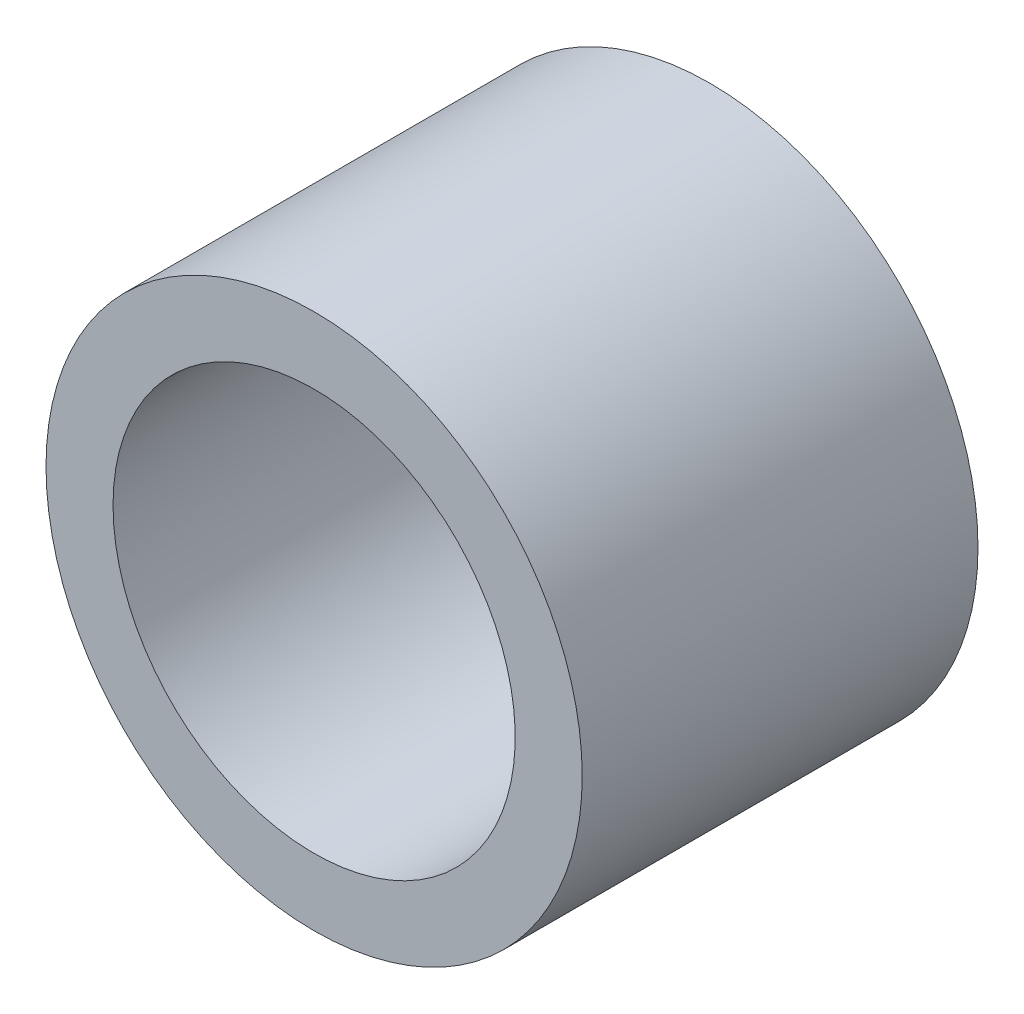
ISO-10303-21;
HEADER;
FILE_DESCRIPTION(('STEP AP214'),'2;1');
FILE_NAME('part.step','',(''),(''),'','','');
FILE_SCHEMA(('AUTOMOTIVE_DESIGN { 1 0 10303 214 1 1 1 1 }'));
ENDSEC;
DATA;
#1=APPLICATION_CONTEXT('core data for automotive mechanical design processes');
#2=APPLICATION_PROTOCOL_DEFINITION('international standard','automotive_design',2000,#1);
#3=PRODUCT_CONTEXT('',#1,'mechanical');
#4=PRODUCT('Part','Part','',(#3));
#5=PRODUCT_RELATED_PRODUCT_CATEGORY('part','',(#4));
#6=PRODUCT_DEFINITION_FORMATION('','',#4);
#7=PRODUCT_DEFINITION_CONTEXT('part definition',#1,'design');
#8=PRODUCT_DEFINITION('design','',#6,#7);
#9=PRODUCT_DEFINITION_SHAPE('','',#8);
#10=(LENGTH_UNIT() NAMED_UNIT(*) SI_UNIT(.MILLI.,.METRE.));
#11=(NAMED_UNIT(*) PLANE_ANGLE_UNIT() SI_UNIT($,.RADIAN.));
#12=(NAMED_UNIT(*) SI_UNIT($,.STERADIAN.) SOLID_ANGLE_UNIT());
#13=UNCERTAINTY_MEASURE_WITH_UNIT(LENGTH_MEASURE(1.E-05),#10,'distance_accuracy_value','');
#14=(GEOMETRIC_REPRESENTATION_CONTEXT(3) GLOBAL_UNCERTAINTY_ASSIGNED_CONTEXT((#13)) GLOBAL_UNIT_ASSIGNED_CONTEXT((#10,
#11,#12)) REPRESENTATION_CONTEXT('',''));
#15=CARTESIAN_POINT('',(0.,0.,0.));
#16=DIRECTION('',(0.,0.,1.));
#17=DIRECTION('',(1.,0.,0.));
#18=AXIS2_PLACEMENT_3D('',#15,#16,#17);
#19=CARTESIAN_POINT('',(0.,0.,6.2));
#20=DIRECTION('',(0.,0.,1.));
#21=DIRECTION('',(1.,0.,0.));
#22=AXIS2_PLACEMENT_3D('',#19,#20,#21);
#23=PLANE('',#22);
#24=CARTESIAN_POINT('',(0.,0.,6.2));
#25=DIRECTION('',(0.,0.,1.));
#26=DIRECTION('',(1.,0.,0.));
#27=AXIS2_PLACEMENT_3D('',#24,#25,#26);
#28=CIRCLE('',#27,4.2);
#29=CARTESIAN_POINT('',(-4.2,0.,6.2));
#30=VERTEX_POINT('',#29);
#31=EDGE_CURVE('E10',#30,#30,#28,.T.);
#32=ORIENTED_EDGE('',*,*,#31,.T.);
#33=EDGE_LOOP('',(#32));
#34=FACE_BOUND('',#33,.T.);
#35=CARTESIAN_POINT('',(0.,0.,6.2));
#36=DIRECTION('',(0.,0.,1.));
#37=DIRECTION('',(1.,0.,0.));
#38=AXIS2_PLACEMENT_3D('',#35,#36,#37);
#39=CIRCLE('',#38,3.15);
#40=CARTESIAN_POINT('',(-3.15,0.,6.2));
#41=VERTEX_POINT('',#40);
#42=EDGE_CURVE('E48',#41,#41,#39,.T.);
#43=ORIENTED_EDGE('',*,*,#42,.F.);
#44=EDGE_LOOP('',(#43));
#45=FACE_BOUND('',#44,.T.);
#46=ADVANCED_FACE('F40',(#34,#45),#23,.T.);
#47=CARTESIAN_POINT('',(0.,0.,0.));
#48=DIRECTION('',(0.,0.,1.));
#49=DIRECTION('',(1.,0.,0.));
#50=AXIS2_PLACEMENT_3D('',#47,#48,#49);
#51=PLANE('',#50);
#52=CARTESIAN_POINT('',(0.,0.,0.));
#53=DIRECTION('',(0.,0.,1.));
#54=DIRECTION('',(1.,0.,0.));
#55=AXIS2_PLACEMENT_3D('',#52,#53,#54);
#56=CIRCLE('',#55,4.2);
#57=CARTESIAN_POINT('',(-4.2,0.,0.));
#58=VERTEX_POINT('',#57);
#59=EDGE_CURVE('E41',#58,#58,#56,.T.);
#60=ORIENTED_EDGE('',*,*,#59,.F.);
#61=EDGE_LOOP('',(#60));
#62=FACE_BOUND('',#61,.T.);
#63=CARTESIAN_POINT('',(0.,0.,0.));
#64=DIRECTION('',(0.,0.,1.));
#65=DIRECTION('',(1.,0.,0.));
#66=AXIS2_PLACEMENT_3D('',#63,#64,#65);
#67=CIRCLE('',#66,3.15);
#68=CARTESIAN_POINT('',(-3.15,0.,0.));
#69=VERTEX_POINT('',#68);
#70=EDGE_CURVE('E49',#69,#69,#67,.T.);
#71=ORIENTED_EDGE('',*,*,#70,.T.);
#72=EDGE_LOOP('',(#71));
#73=FACE_BOUND('',#72,.T.);
#74=ADVANCED_FACE('F58',(#62,#73),#51,.F.);
#75=CARTESIAN_POINT('',(0.,0.,6.2));
#76=DIRECTION('',(0.,0.,-1.));
#77=DIRECTION('',(-1.,0.,0.));
#78=AXIS2_PLACEMENT_3D('',#75,#76,#77);
#79=CYLINDRICAL_SURFACE('',#78,4.2);
#80=CARTESIAN_POINT('',(-4.2,0.,6.2));
#81=CARTESIAN_POINT('',(-4.2,0.,6.13541666666667));
#82=CARTESIAN_POINT('',(-4.2,0.,6.07083333333333));
#83=CARTESIAN_POINT('',(-4.2,0.,5.94166666666667));
#84=CARTESIAN_POINT('',(-4.2,0.,5.87708333333333));
#85=CARTESIAN_POINT('',(-4.2,0.,5.74791666666667));
#86=CARTESIAN_POINT('',(-4.2,0.,5.68333333333333));
#87=CARTESIAN_POINT('',(-4.2,0.,5.55416666666667));
#88=CARTESIAN_POINT('',(-4.2,0.,5.48958333333333));
#89=CARTESIAN_POINT('',(-4.2,0.,5.36041666666667));
#90=CARTESIAN_POINT('',(-4.2,0.,5.29583333333333));
#91=CARTESIAN_POINT('',(-4.2,0.,5.16666666666667));
#92=CARTESIAN_POINT('',(-4.2,0.,5.10208333333333));
#93=CARTESIAN_POINT('',(-4.2,0.,4.97291666666667));
#94=CARTESIAN_POINT('',(-4.2,0.,4.90833333333333));
#95=CARTESIAN_POINT('',(-4.2,0.,4.77916666666667));
#96=CARTESIAN_POINT('',(-4.2,0.,4.71458333333333));
#97=CARTESIAN_POINT('',(-4.2,0.,4.58541666666667));
#98=CARTESIAN_POINT('',(-4.2,0.,4.52083333333333));
#99=CARTESIAN_POINT('',(-4.2,0.,4.39166666666667));
#100=CARTESIAN_POINT('',(-4.2,0.,4.32708333333333));
#101=CARTESIAN_POINT('',(-4.2,0.,4.19791666666667));
#102=CARTESIAN_POINT('',(-4.2,0.,4.13333333333333));
#103=CARTESIAN_POINT('',(-4.2,0.,4.00416666666667));
#104=CARTESIAN_POINT('',(-4.2,0.,3.93958333333333));
#105=CARTESIAN_POINT('',(-4.2,0.,3.81041666666667));
#106=CARTESIAN_POINT('',(-4.2,0.,3.74583333333333));
#107=CARTESIAN_POINT('',(-4.2,0.,3.61666666666667));
#108=CARTESIAN_POINT('',(-4.2,0.,3.55208333333333));
#109=CARTESIAN_POINT('',(-4.2,0.,3.42291666666667));
#110=CARTESIAN_POINT('',(-4.2,0.,3.35833333333333));
#111=CARTESIAN_POINT('',(-4.2,0.,3.22916666666667));
#112=CARTESIAN_POINT('',(-4.2,0.,3.16458333333333));
#113=CARTESIAN_POINT('',(-4.2,0.,3.03541666666667));
#114=CARTESIAN_POINT('',(-4.2,0.,2.97083333333333));
#115=CARTESIAN_POINT('',(-4.2,0.,2.84166666666667));
#116=CARTESIAN_POINT('',(-4.2,0.,2.77708333333333));
#117=CARTESIAN_POINT('',(-4.2,0.,2.64791666666667));
#118=CARTESIAN_POINT('',(-4.2,0.,2.58333333333333));
#119=CARTESIAN_POINT('',(-4.2,0.,2.45416666666667));
#120=CARTESIAN_POINT('',(-4.2,0.,2.38958333333333));
#121=CARTESIAN_POINT('',(-4.2,0.,2.26041666666667));
#122=CARTESIAN_POINT('',(-4.2,0.,2.19583333333333));
#123=CARTESIAN_POINT('',(-4.2,0.,2.06666666666667));
#124=CARTESIAN_POINT('',(-4.2,0.,2.00208333333333));
#125=CARTESIAN_POINT('',(-4.2,0.,1.87291666666667));
#126=CARTESIAN_POINT('',(-4.2,0.,1.80833333333333));
#127=CARTESIAN_POINT('',(-4.2,0.,1.67916666666667));
#128=CARTESIAN_POINT('',(-4.2,0.,1.61458333333333));
#129=CARTESIAN_POINT('',(-4.2,0.,1.48541666666667));
#130=CARTESIAN_POINT('',(-4.2,0.,1.42083333333333));
#131=CARTESIAN_POINT('',(-4.2,0.,1.29166666666667));
#132=CARTESIAN_POINT('',(-4.2,0.,1.22708333333333));
#133=CARTESIAN_POINT('',(-4.2,0.,1.09791666666667));
#134=CARTESIAN_POINT('',(-4.2,0.,1.03333333333333));
#135=CARTESIAN_POINT('',(-4.2,0.,0.904166666666667));
#136=CARTESIAN_POINT('',(-4.2,0.,0.839583333333333));
#137=CARTESIAN_POINT('',(-4.2,0.,0.710416666666666));
#138=CARTESIAN_POINT('',(-4.2,0.,0.645833333333333));
#139=CARTESIAN_POINT('',(-4.2,0.,0.516666666666667));
#140=CARTESIAN_POINT('',(-4.2,0.,0.452083333333333));
#141=CARTESIAN_POINT('',(-4.2,0.,0.322916666666667));
#142=CARTESIAN_POINT('',(-4.2,0.,0.258333333333334));
#143=CARTESIAN_POINT('',(-4.2,0.,0.129166666666667));
#144=CARTESIAN_POINT('',(-4.2,0.,0.0645833333333335));
#145=CARTESIAN_POINT('',(-4.2,0.,0.));
#146=B_SPLINE_CURVE_WITH_KNOTS('',3,(#80,#81,#82,#83,#84,#85,#86,#87,#88,#89,#90,#91,#92,#93,
#94,#95,#96,#97,#98,#99,#100,#101,#102,#103,#104,#105,#106,#107,#108,#109,#110,#111,#112,#113,
#114,#115,#116,#117,#118,#119,#120,#121,#122,#123,#124,#125,#126,#127,#128,#129,#130,#131,#132,
#133,#134,#135,#136,#137,#138,#139,#140,#141,#142,#143,#144,#145),.UNSPECIFIED.,.F.,.F.,(4,2,2,
2,2,2,2,2,2,2,2,2,2,2,2,2,2,2,2,2,2,2,2,2,2,2,2,2,2,2,2,2,4),(0.,0.193749999999999,0.3875,
0.581249999999999,0.775,0.968749999999999,1.1625,1.35625,1.55,1.74375,1.9375,2.13125,2.325,
2.51875,2.7125,2.90625,3.1,3.29375,3.4875,3.68125,3.875,4.06875,4.2625,4.45625,4.65,4.84375,
5.0375,5.23125,5.425,5.61875,5.8125,6.00625,6.2),.UNSPECIFIED.);
#147=EDGE_CURVE('BSEAM39',#30,#58,#146,.T.);
#148=ORIENTED_EDGE('',*,*,#31,.F.);
#149=ORIENTED_EDGE('',*,*,#59,.T.);
#150=ORIENTED_EDGE('',*,*,#147,.T.);
#151=ORIENTED_EDGE('',*,*,#147,.F.);
#152=EDGE_LOOP('',(#148,#150,#149,#151));
#153=FACE_BOUND('',#152,.T.);
#154=ADVANCED_FACE('F39',(#153),#79,.T.);
#155=CARTESIAN_POINT('',(0.,0.,6.2));
#156=DIRECTION('',(0.,0.,-1.));
#157=DIRECTION('',(-1.,0.,0.));
#158=AXIS2_PLACEMENT_3D('',#155,#156,#157);
#159=CYLINDRICAL_SURFACE('',#158,3.15);
#160=CARTESIAN_POINT('',(-3.15,0.,6.2));
#161=CARTESIAN_POINT('',(-3.15,0.,6.13541666666667));
#162=CARTESIAN_POINT('',(-3.15,0.,6.07083333333333));
#163=CARTESIAN_POINT('',(-3.15,0.,5.94166666666667));
#164=CARTESIAN_POINT('',(-3.15,0.,5.87708333333333));
#165=CARTESIAN_POINT('',(-3.15,0.,5.74791666666667));
#166=CARTESIAN_POINT('',(-3.15,0.,5.68333333333333));
#167=CARTESIAN_POINT('',(-3.15,0.,5.55416666666667));
#168=CARTESIAN_POINT('',(-3.15,0.,5.48958333333333));
#169=CARTESIAN_POINT('',(-3.15,0.,5.36041666666667));
#170=CARTESIAN_POINT('',(-3.15,0.,5.29583333333333));
#171=CARTESIAN_POINT('',(-3.15,0.,5.16666666666667));
#172=CARTESIAN_POINT('',(-3.15,0.,5.10208333333333));
#173=CARTESIAN_POINT('',(-3.15,0.,4.97291666666667));
#174=CARTESIAN_POINT('',(-3.15,0.,4.90833333333333));
#175=CARTESIAN_POINT('',(-3.15,0.,4.77916666666667));
#176=CARTESIAN_POINT('',(-3.15,0.,4.71458333333333));
#177=CARTESIAN_POINT('',(-3.15,0.,4.58541666666667));
#178=CARTESIAN_POINT('',(-3.15,0.,4.52083333333333));
#179=CARTESIAN_POINT('',(-3.15,0.,4.39166666666667));
#180=CARTESIAN_POINT('',(-3.15,0.,4.32708333333333));
#181=CARTESIAN_POINT('',(-3.15,0.,4.19791666666667));
#182=CARTESIAN_POINT('',(-3.15,0.,4.13333333333333));
#183=CARTESIAN_POINT('',(-3.15,0.,4.00416666666667));
#184=CARTESIAN_POINT('',(-3.15,0.,3.93958333333333));
#185=CARTESIAN_POINT('',(-3.15,0.,3.81041666666667));
#186=CARTESIAN_POINT('',(-3.15,0.,3.74583333333333));
#187=CARTESIAN_POINT('',(-3.15,0.,3.61666666666667));
#188=CARTESIAN_POINT('',(-3.15,0.,3.55208333333333));
#189=CARTESIAN_POINT('',(-3.15,0.,3.42291666666667));
#190=CARTESIAN_POINT('',(-3.15,0.,3.35833333333333));
#191=CARTESIAN_POINT('',(-3.15,0.,3.22916666666667));
#192=CARTESIAN_POINT('',(-3.15,0.,3.16458333333333));
#193=CARTESIAN_POINT('',(-3.15,0.,3.03541666666667));
#194=CARTESIAN_POINT('',(-3.15,0.,2.97083333333333));
#195=CARTESIAN_POINT('',(-3.15,0.,2.84166666666667));
#196=CARTESIAN_POINT('',(-3.15,0.,2.77708333333333));
#197=CARTESIAN_POINT('',(-3.15,0.,2.64791666666667));
#198=CARTESIAN_POINT('',(-3.15,0.,2.58333333333333));
#199=CARTESIAN_POINT('',(-3.15,0.,2.45416666666667));
#200=CARTESIAN_POINT('',(-3.15,0.,2.38958333333333));
#201=CARTESIAN_POINT('',(-3.15,0.,2.26041666666667));
#202=CARTESIAN_POINT('',(-3.15,0.,2.19583333333333));
#203=CARTESIAN_POINT('',(-3.15,0.,2.06666666666667));
#204=CARTESIAN_POINT('',(-3.15,0.,2.00208333333333));
#205=CARTESIAN_POINT('',(-3.15,0.,1.87291666666667));
#206=CARTESIAN_POINT('',(-3.15,0.,1.80833333333333));
#207=CARTESIAN_POINT('',(-3.15,0.,1.67916666666667));
#208=CARTESIAN_POINT('',(-3.15,0.,1.61458333333333));
#209=CARTESIAN_POINT('',(-3.15,0.,1.48541666666667));
#210=CARTESIAN_POINT('',(-3.15,0.,1.42083333333333));
#211=CARTESIAN_POINT('',(-3.15,0.,1.29166666666667));
#212=CARTESIAN_POINT('',(-3.15,0.,1.22708333333333));
#213=CARTESIAN_POINT('',(-3.15,0.,1.09791666666667));
#214=CARTESIAN_POINT('',(-3.15,0.,1.03333333333333));
#215=CARTESIAN_POINT('',(-3.15,0.,0.904166666666667));
#216=CARTESIAN_POINT('',(-3.15,0.,0.839583333333333));
#217=CARTESIAN_POINT('',(-3.15,0.,0.710416666666666));
#218=CARTESIAN_POINT('',(-3.15,0.,0.645833333333333));
#219=CARTESIAN_POINT('',(-3.15,0.,0.516666666666667));
#220=CARTESIAN_POINT('',(-3.15,0.,0.452083333333333));
#221=CARTESIAN_POINT('',(-3.15,0.,0.322916666666667));
#222=CARTESIAN_POINT('',(-3.15,0.,0.258333333333334));
#223=CARTESIAN_POINT('',(-3.15,0.,0.129166666666667));
#224=CARTESIAN_POINT('',(-3.15,0.,0.0645833333333335));
#225=CARTESIAN_POINT('',(-3.15,0.,0.));
#226=B_SPLINE_CURVE_WITH_KNOTS('',3,(#160,#161,#162,#163,#164,#165,#166,#167,#168,#169,#170,
#171,#172,#173,#174,#175,#176,#177,#178,#179,#180,#181,#182,#183,#184,#185,#186,#187,#188,#189,
#190,#191,#192,#193,#194,#195,#196,#197,#198,#199,#200,#201,#202,#203,#204,#205,#206,#207,#208,
#209,#210,#211,#212,#213,#214,#215,#216,#217,#218,#219,#220,#221,#222,#223,#224,#225),
.UNSPECIFIED.,.F.,.F.,(4,2,2,2,2,2,2,2,2,2,2,2,2,2,2,2,2,2,2,2,2,2,2,2,2,2,2,2,2,2,2,2,4),(0.,
0.193749999999999,0.3875,0.581249999999999,0.775,0.968749999999999,1.1625,1.35625,1.55,1.74375,
1.9375,2.13125,2.325,2.51875,2.7125,2.90625,3.1,3.29375,3.4875,3.68125,3.875,4.06875,4.2625,
4.45625,4.65,4.84375,5.0375,5.23125,5.425,5.61875,5.8125,6.00625,6.2),.UNSPECIFIED.);
#227=EDGE_CURVE('BSEAM57',#41,#69,#226,.T.);
#228=ORIENTED_EDGE('',*,*,#42,.T.);
#229=ORIENTED_EDGE('',*,*,#70,.F.);
#230=ORIENTED_EDGE('',*,*,#227,.T.);
#231=ORIENTED_EDGE('',*,*,#227,.F.);
#232=EDGE_LOOP('',(#228,#230,#229,#231));
#233=FACE_BOUND('',#232,.T.);
#234=ADVANCED_FACE('F57',(#233),#159,.F.);
#235=CLOSED_SHELL('',(#46,#74,#154,#234));
#236=MANIFOLD_SOLID_BREP('B2',#235);
#237=ADVANCED_BREP_SHAPE_REPRESENTATION('',(#18,#236),#14);
#238=SHAPE_DEFINITION_REPRESENTATION(#9,#237);
ENDSEC;
END-ISO-10303-21;
